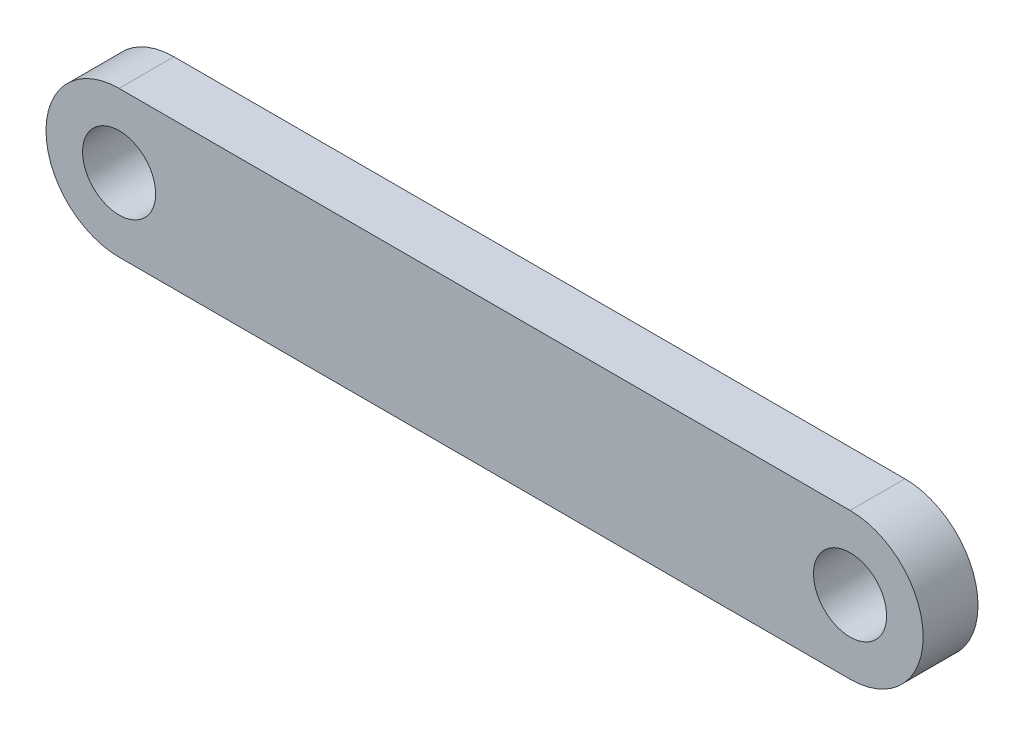
ISO-10303-21;
HEADER;
FILE_DESCRIPTION(('STEP AP214'),'2;1');
FILE_NAME('part.step','',(''),(''),'','','');
FILE_SCHEMA(('AUTOMOTIVE_DESIGN { 1 0 10303 214 1 1 1 1 }'));
ENDSEC;
DATA;
#1=APPLICATION_CONTEXT('core data for automotive mechanical design processes');
#2=APPLICATION_PROTOCOL_DEFINITION('international standard','automotive_design',2000,#1);
#3=PRODUCT_CONTEXT('',#1,'mechanical');
#4=PRODUCT('Part','Part','',(#3));
#5=PRODUCT_RELATED_PRODUCT_CATEGORY('part','',(#4));
#6=PRODUCT_DEFINITION_FORMATION('','',#4);
#7=PRODUCT_DEFINITION_CONTEXT('part definition',#1,'design');
#8=PRODUCT_DEFINITION('design','',#6,#7);
#9=PRODUCT_DEFINITION_SHAPE('','',#8);
#10=(LENGTH_UNIT() NAMED_UNIT(*) SI_UNIT(.MILLI.,.METRE.));
#11=(NAMED_UNIT(*) PLANE_ANGLE_UNIT() SI_UNIT($,.RADIAN.));
#12=(NAMED_UNIT(*) SI_UNIT($,.STERADIAN.) SOLID_ANGLE_UNIT());
#13=UNCERTAINTY_MEASURE_WITH_UNIT(LENGTH_MEASURE(1.E-05),#10,'distance_accuracy_value','');
#14=(GEOMETRIC_REPRESENTATION_CONTEXT(3) GLOBAL_UNCERTAINTY_ASSIGNED_CONTEXT((#13)) GLOBAL_UNIT_ASSIGNED_CONTEXT((#10,
#11,#12)) REPRESENTATION_CONTEXT('',''));
#15=CARTESIAN_POINT('',(0.,0.,0.));
#16=DIRECTION('',(0.,0.,1.));
#17=DIRECTION('',(1.,0.,0.));
#18=AXIS2_PLACEMENT_3D('',#15,#16,#17);
#19=CARTESIAN_POINT('',(-25.4,0.,3.81));
#20=DIRECTION('',(0.,0.,1.));
#21=DIRECTION('',(1.,0.,0.));
#22=AXIS2_PLACEMENT_3D('',#19,#20,#21);
#23=PLANE('',#22);
#24=CARTESIAN_POINT('',(-25.4,0.,3.81));
#25=DIRECTION('',(0.,0.,1.));
#26=DIRECTION('',(1.,0.,0.));
#27=AXIS2_PLACEMENT_3D('',#24,#25,#26);
#28=CIRCLE('',#27,2.54);
#29=CARTESIAN_POINT('',(-27.94,0.,3.81));
#30=VERTEX_POINT('',#29);
#31=EDGE_CURVE('E104',#30,#30,#28,.T.);
#32=ORIENTED_EDGE('',*,*,#31,.F.);
#33=EDGE_LOOP('',(#32));
#34=FACE_BOUND('',#33,.T.);
#35=CARTESIAN_POINT('',(-25.4,0.,3.81));
#36=DIRECTION('',(0.,0.,1.));
#37=DIRECTION('',(1.,0.,0.));
#38=AXIS2_PLACEMENT_3D('',#35,#36,#37);
#39=CIRCLE('',#38,5.08);
#40=CARTESIAN_POINT('',(-25.4,5.08,3.81));
#41=VERTEX_POINT('',#40);
#42=CARTESIAN_POINT('',(-25.4,-5.08,3.81));
#43=VERTEX_POINT('',#42);
#44=EDGE_CURVE('E89',#41,#43,#39,.T.);
#45=ORIENTED_EDGE('',*,*,#44,.T.);
#46=DIRECTION('',(1.,0.,0.));
#47=VECTOR('',#46,1.);
#48=CARTESIAN_POINT('',(-25.4,-5.08,3.81));
#49=LINE('',#48,#47);
#50=CARTESIAN_POINT('',(25.4,-5.07999999999999,3.81));
#51=VERTEX_POINT('',#50);
#52=EDGE_CURVE('E84',#43,#51,#49,.T.);
#53=ORIENTED_EDGE('',*,*,#52,.T.);
#54=CARTESIAN_POINT('',(25.4,0.,3.81));
#55=DIRECTION('',(0.,0.,1.));
#56=DIRECTION('',(1.,0.,0.));
#57=AXIS2_PLACEMENT_3D('',#54,#55,#56);
#58=CIRCLE('',#57,5.08);
#59=CARTESIAN_POINT('',(25.4,5.08000000000001,3.81));
#60=VERTEX_POINT('',#59);
#61=EDGE_CURVE('E87',#51,#60,#58,.T.);
#62=ORIENTED_EDGE('',*,*,#61,.T.);
#63=DIRECTION('',(-1.,0.,0.));
#64=VECTOR('',#63,1.);
#65=CARTESIAN_POINT('',(-25.4,5.08,3.81));
#66=LINE('',#65,#64);
#67=EDGE_CURVE('E54',#60,#41,#66,.T.);
#68=ORIENTED_EDGE('',*,*,#67,.T.);
#69=EDGE_LOOP('',(#45,#53,#62,#68));
#70=FACE_BOUND('',#69,.T.);
#71=CARTESIAN_POINT('',(25.4,0.,3.81));
#72=DIRECTION('',(0.,0.,1.));
#73=DIRECTION('',(1.,0.,0.));
#74=AXIS2_PLACEMENT_3D('',#71,#72,#73);
#75=CIRCLE('',#74,2.54);
#76=CARTESIAN_POINT('',(22.86,0.,3.81));
#77=VERTEX_POINT('',#76);
#78=EDGE_CURVE('E119',#77,#77,#75,.T.);
#79=ORIENTED_EDGE('',*,*,#78,.F.);
#80=EDGE_LOOP('',(#79));
#81=FACE_BOUND('',#80,.T.);
#82=ADVANCED_FACE('F37',(#34,#70,#81),#23,.T.);
#83=CARTESIAN_POINT('',(-25.4,0.,0.));
#84=DIRECTION('',(0.,0.,1.));
#85=DIRECTION('',(1.,0.,0.));
#86=AXIS2_PLACEMENT_3D('',#83,#84,#85);
#87=PLANE('',#86);
#88=CARTESIAN_POINT('',(-25.4,0.,0.));
#89=DIRECTION('',(0.,0.,1.));
#90=DIRECTION('',(1.,0.,0.));
#91=AXIS2_PLACEMENT_3D('',#88,#89,#90);
#92=CIRCLE('',#91,5.08);
#93=CARTESIAN_POINT('',(-25.4,5.08,0.));
#94=VERTEX_POINT('',#93);
#95=CARTESIAN_POINT('',(-25.4,-5.08,0.));
#96=VERTEX_POINT('',#95);
#97=EDGE_CURVE('E101',#94,#96,#92,.T.);
#98=ORIENTED_EDGE('',*,*,#97,.F.);
#99=DIRECTION('',(-1.,0.,0.));
#100=VECTOR('',#99,1.);
#101=CARTESIAN_POINT('',(-25.4,5.08,0.));
#102=LINE('',#101,#100);
#103=CARTESIAN_POINT('',(25.4,5.08000000000001,0.));
#104=VERTEX_POINT('',#103);
#105=EDGE_CURVE('E77',#104,#94,#102,.T.);
#106=ORIENTED_EDGE('',*,*,#105,.F.);
#107=CARTESIAN_POINT('',(25.4,0.,0.));
#108=DIRECTION('',(0.,0.,1.));
#109=DIRECTION('',(1.,0.,0.));
#110=AXIS2_PLACEMENT_3D('',#107,#108,#109);
#111=CIRCLE('',#110,5.08);
#112=CARTESIAN_POINT('',(25.4,-5.07999999999999,0.));
#113=VERTEX_POINT('',#112);
#114=EDGE_CURVE('E71',#113,#104,#111,.T.);
#115=ORIENTED_EDGE('',*,*,#114,.F.);
#116=DIRECTION('',(1.,0.,0.));
#117=VECTOR('',#116,1.);
#118=CARTESIAN_POINT('',(-25.4,-5.08,0.));
#119=LINE('',#118,#117);
#120=EDGE_CURVE('E93',#96,#113,#119,.T.);
#121=ORIENTED_EDGE('',*,*,#120,.F.);
#122=EDGE_LOOP('',(#98,#106,#115,#121));
#123=FACE_BOUND('',#122,.T.);
#124=CARTESIAN_POINT('',(-25.4,0.,0.));
#125=DIRECTION('',(0.,0.,1.));
#126=DIRECTION('',(1.,0.,0.));
#127=AXIS2_PLACEMENT_3D('',#124,#125,#126);
#128=CIRCLE('',#127,2.54);
#129=CARTESIAN_POINT('',(-27.94,0.,0.));
#130=VERTEX_POINT('',#129);
#131=EDGE_CURVE('E116',#130,#130,#128,.T.);
#132=ORIENTED_EDGE('',*,*,#131,.T.);
#133=EDGE_LOOP('',(#132));
#134=FACE_BOUND('',#133,.T.);
#135=CARTESIAN_POINT('',(25.4,0.,0.));
#136=DIRECTION('',(0.,0.,1.));
#137=DIRECTION('',(1.,0.,0.));
#138=AXIS2_PLACEMENT_3D('',#135,#136,#137);
#139=CIRCLE('',#138,2.54);
#140=CARTESIAN_POINT('',(22.86,0.,0.));
#141=VERTEX_POINT('',#140);
#142=EDGE_CURVE('E122',#141,#141,#139,.T.);
#143=ORIENTED_EDGE('',*,*,#142,.T.);
#144=EDGE_LOOP('',(#143));
#145=FACE_BOUND('',#144,.T.);
#146=ADVANCED_FACE('F112',(#123,#134,#145),#87,.F.);
#147=CARTESIAN_POINT('',(-25.4,0.,3.81));
#148=DIRECTION('',(0.,0.,-1.));
#149=DIRECTION('',(-1.,0.,0.));
#150=AXIS2_PLACEMENT_3D('',#147,#148,#149);
#151=CYLINDRICAL_SURFACE('',#150,5.08);
#152=ORIENTED_EDGE('',*,*,#97,.T.);
#153=DIRECTION('',(0.,0.,-1.));
#154=VECTOR('',#153,1.);
#155=CARTESIAN_POINT('',(-25.4,-5.08,3.81));
#156=LINE('',#155,#154);
#157=EDGE_CURVE('E11',#43,#96,#156,.T.);
#158=ORIENTED_EDGE('',*,*,#157,.F.);
#159=ORIENTED_EDGE('',*,*,#44,.F.);
#160=DIRECTION('',(0.,0.,-1.));
#161=VECTOR('',#160,1.);
#162=CARTESIAN_POINT('',(-25.4,5.08,3.81));
#163=LINE('',#162,#161);
#164=EDGE_CURVE('E97',#41,#94,#163,.T.);
#165=ORIENTED_EDGE('',*,*,#164,.T.);
#166=EDGE_LOOP('',(#152,#158,#159,#165));
#167=FACE_BOUND('',#166,.T.);
#168=ADVANCED_FACE('F39',(#167),#151,.T.);
#169=CARTESIAN_POINT('',(-25.4,-5.08,3.81));
#170=DIRECTION('',(0.,1.,0.));
#171=DIRECTION('',(-1.,0.,0.));
#172=AXIS2_PLACEMENT_3D('',#169,#170,#171);
#173=PLANE('',#172);
#174=ORIENTED_EDGE('',*,*,#120,.T.);
#175=DIRECTION('',(0.,0.,-1.));
#176=VECTOR('',#175,1.);
#177=CARTESIAN_POINT('',(25.4,-5.07999999999999,3.81));
#178=LINE('',#177,#176);
#179=EDGE_CURVE('E46',#51,#113,#178,.T.);
#180=ORIENTED_EDGE('',*,*,#179,.F.);
#181=ORIENTED_EDGE('',*,*,#52,.F.);
#182=ORIENTED_EDGE('',*,*,#157,.T.);
#183=EDGE_LOOP('',(#174,#180,#181,#182));
#184=FACE_BOUND('',#183,.T.);
#185=ADVANCED_FACE('F92',(#184),#173,.F.);
#186=CARTESIAN_POINT('',(25.4,0.,3.81));
#187=DIRECTION('',(0.,0.,-1.));
#188=DIRECTION('',(-1.,0.,0.));
#189=AXIS2_PLACEMENT_3D('',#186,#187,#188);
#190=CYLINDRICAL_SURFACE('',#189,5.08);
#191=ORIENTED_EDGE('',*,*,#114,.T.);
#192=DIRECTION('',(0.,0.,-1.));
#193=VECTOR('',#192,1.);
#194=CARTESIAN_POINT('',(25.4,5.08000000000001,3.81));
#195=LINE('',#194,#193);
#196=EDGE_CURVE('E94',#60,#104,#195,.T.);
#197=ORIENTED_EDGE('',*,*,#196,.F.);
#198=ORIENTED_EDGE('',*,*,#61,.F.);
#199=ORIENTED_EDGE('',*,*,#179,.T.);
#200=EDGE_LOOP('',(#191,#197,#198,#199));
#201=FACE_BOUND('',#200,.T.);
#202=ADVANCED_FACE('F95',(#201),#190,.T.);
#203=CARTESIAN_POINT('',(-25.4,5.08,3.81));
#204=DIRECTION('',(0.,-1.,0.));
#205=DIRECTION('',(1.,0.,0.));
#206=AXIS2_PLACEMENT_3D('',#203,#204,#205);
#207=PLANE('',#206);
#208=ORIENTED_EDGE('',*,*,#105,.T.);
#209=ORIENTED_EDGE('',*,*,#164,.F.);
#210=ORIENTED_EDGE('',*,*,#67,.F.);
#211=ORIENTED_EDGE('',*,*,#196,.T.);
#212=EDGE_LOOP('',(#208,#209,#210,#211));
#213=FACE_BOUND('',#212,.T.);
#214=ADVANCED_FACE('F109',(#213),#207,.F.);
#215=CARTESIAN_POINT('',(-25.4,0.,3.81));
#216=DIRECTION('',(0.,0.,-1.));
#217=DIRECTION('',(-1.,0.,0.));
#218=AXIS2_PLACEMENT_3D('',#215,#216,#217);
#219=CYLINDRICAL_SURFACE('',#218,2.54);
#220=CARTESIAN_POINT('',(-27.94,0.,3.81));
#221=CARTESIAN_POINT('',(-27.94,0.,3.7703125));
#222=CARTESIAN_POINT('',(-27.94,0.,3.730625));
#223=CARTESIAN_POINT('',(-27.94,0.,3.65125));
#224=CARTESIAN_POINT('',(-27.94,0.,3.6115625));
#225=CARTESIAN_POINT('',(-27.94,0.,3.5321875));
#226=CARTESIAN_POINT('',(-27.94,0.,3.4925));
#227=CARTESIAN_POINT('',(-27.94,0.,3.413125));
#228=CARTESIAN_POINT('',(-27.94,0.,3.3734375));
#229=CARTESIAN_POINT('',(-27.94,0.,3.2940625));
#230=CARTESIAN_POINT('',(-27.94,0.,3.254375));
#231=CARTESIAN_POINT('',(-27.94,0.,3.175));
#232=CARTESIAN_POINT('',(-27.94,0.,3.1353125));
#233=CARTESIAN_POINT('',(-27.94,0.,3.0559375));
#234=CARTESIAN_POINT('',(-27.94,0.,3.01625));
#235=CARTESIAN_POINT('',(-27.94,0.,2.936875));
#236=CARTESIAN_POINT('',(-27.94,0.,2.8971875));
#237=CARTESIAN_POINT('',(-27.94,0.,2.8178125));
#238=CARTESIAN_POINT('',(-27.94,0.,2.778125));
#239=CARTESIAN_POINT('',(-27.94,0.,2.69875));
#240=CARTESIAN_POINT('',(-27.94,0.,2.6590625));
#241=CARTESIAN_POINT('',(-27.94,0.,2.5796875));
#242=CARTESIAN_POINT('',(-27.94,0.,2.54));
#243=CARTESIAN_POINT('',(-27.94,0.,2.460625));
#244=CARTESIAN_POINT('',(-27.94,0.,2.4209375));
#245=CARTESIAN_POINT('',(-27.94,0.,2.3415625));
#246=CARTESIAN_POINT('',(-27.94,0.,2.301875));
#247=CARTESIAN_POINT('',(-27.94,0.,2.2225));
#248=CARTESIAN_POINT('',(-27.94,0.,2.1828125));
#249=CARTESIAN_POINT('',(-27.94,0.,2.1034375));
#250=CARTESIAN_POINT('',(-27.94,0.,2.06375));
#251=CARTESIAN_POINT('',(-27.94,0.,1.984375));
#252=CARTESIAN_POINT('',(-27.94,0.,1.9446875));
#253=CARTESIAN_POINT('',(-27.94,0.,1.8653125));
#254=CARTESIAN_POINT('',(-27.94,0.,1.825625));
#255=CARTESIAN_POINT('',(-27.94,0.,1.74625));
#256=CARTESIAN_POINT('',(-27.94,0.,1.7065625));
#257=CARTESIAN_POINT('',(-27.94,0.,1.6271875));
#258=CARTESIAN_POINT('',(-27.94,0.,1.5875));
#259=CARTESIAN_POINT('',(-27.94,0.,1.508125));
#260=CARTESIAN_POINT('',(-27.94,0.,1.4684375));
#261=CARTESIAN_POINT('',(-27.94,0.,1.3890625));
#262=CARTESIAN_POINT('',(-27.94,0.,1.349375));
#263=CARTESIAN_POINT('',(-27.94,0.,1.27));
#264=CARTESIAN_POINT('',(-27.94,0.,1.2303125));
#265=CARTESIAN_POINT('',(-27.94,0.,1.1509375));
#266=CARTESIAN_POINT('',(-27.94,0.,1.11125));
#267=CARTESIAN_POINT('',(-27.94,0.,1.031875));
#268=CARTESIAN_POINT('',(-27.94,0.,0.9921875));
#269=CARTESIAN_POINT('',(-27.94,0.,0.9128125));
#270=CARTESIAN_POINT('',(-27.94,0.,0.873125));
#271=CARTESIAN_POINT('',(-27.94,0.,0.79375));
#272=CARTESIAN_POINT('',(-27.94,0.,0.7540625));
#273=CARTESIAN_POINT('',(-27.94,0.,0.6746875));
#274=CARTESIAN_POINT('',(-27.94,0.,0.635));
#275=CARTESIAN_POINT('',(-27.94,0.,0.555625));
#276=CARTESIAN_POINT('',(-27.94,0.,0.5159375));
#277=CARTESIAN_POINT('',(-27.94,0.,0.4365625));
#278=CARTESIAN_POINT('',(-27.94,0.,0.396875));
#279=CARTESIAN_POINT('',(-27.94,0.,0.3175));
#280=CARTESIAN_POINT('',(-27.94,0.,0.2778125));
#281=CARTESIAN_POINT('',(-27.94,0.,0.1984375));
#282=CARTESIAN_POINT('',(-27.94,0.,0.15875));
#283=CARTESIAN_POINT('',(-27.94,0.,0.0793749999999999));
#284=CARTESIAN_POINT('',(-27.94,0.,0.0396874999999999));
#285=CARTESIAN_POINT('',(-27.94,0.,0.));
#286=B_SPLINE_CURVE_WITH_KNOTS('',3,(#220,#221,#222,#223,#224,#225,#226,#227,#228,#229,#230,
#231,#232,#233,#234,#235,#236,#237,#238,#239,#240,#241,#242,#243,#244,#245,#246,#247,#248,#249,
#250,#251,#252,#253,#254,#255,#256,#257,#258,#259,#260,#261,#262,#263,#264,#265,#266,#267,#268,
#269,#270,#271,#272,#273,#274,#275,#276,#277,#278,#279,#280,#281,#282,#283,#284,#285),
.UNSPECIFIED.,.F.,.F.,(4,2,2,2,2,2,2,2,2,2,2,2,2,2,2,2,2,2,2,2,2,2,2,2,2,2,2,2,2,2,2,2,4),(0.,
0.1190625,0.238125,0.3571875,0.47625,0.5953125,0.714375,0.8334375,0.9525,1.0715625,1.190625,
1.3096875,1.42875,1.5478125,1.666875,1.7859375,1.905,2.0240625,2.143125,2.2621875,2.38125,
2.5003125,2.619375,2.7384375,2.8575,2.9765625,3.095625,3.2146875,3.33375,3.4528125,3.571875,
3.6909375,3.81),.UNSPECIFIED.);
#287=EDGE_CURVE('BSEAM139',#30,#130,#286,.T.);
#288=ORIENTED_EDGE('',*,*,#31,.T.);
#289=ORIENTED_EDGE('',*,*,#131,.F.);
#290=ORIENTED_EDGE('',*,*,#287,.T.);
#291=ORIENTED_EDGE('',*,*,#287,.F.);
#292=EDGE_LOOP('',(#288,#290,#289,#291));
#293=FACE_BOUND('',#292,.T.);
#294=ADVANCED_FACE('F139',(#293),#219,.F.);
#295=CARTESIAN_POINT('',(25.4,0.,3.81));
#296=DIRECTION('',(0.,0.,-1.));
#297=DIRECTION('',(-1.,0.,0.));
#298=AXIS2_PLACEMENT_3D('',#295,#296,#297);
#299=CYLINDRICAL_SURFACE('',#298,2.54);
#300=CARTESIAN_POINT('',(22.86,0.,3.81));
#301=CARTESIAN_POINT('',(22.86,0.,3.7703125));
#302=CARTESIAN_POINT('',(22.86,0.,3.730625));
#303=CARTESIAN_POINT('',(22.86,0.,3.65125));
#304=CARTESIAN_POINT('',(22.86,0.,3.6115625));
#305=CARTESIAN_POINT('',(22.86,0.,3.5321875));
#306=CARTESIAN_POINT('',(22.86,0.,3.4925));
#307=CARTESIAN_POINT('',(22.86,0.,3.413125));
#308=CARTESIAN_POINT('',(22.86,0.,3.3734375));
#309=CARTESIAN_POINT('',(22.86,0.,3.2940625));
#310=CARTESIAN_POINT('',(22.86,0.,3.254375));
#311=CARTESIAN_POINT('',(22.86,0.,3.175));
#312=CARTESIAN_POINT('',(22.86,0.,3.1353125));
#313=CARTESIAN_POINT('',(22.86,0.,3.0559375));
#314=CARTESIAN_POINT('',(22.86,0.,3.01625));
#315=CARTESIAN_POINT('',(22.86,0.,2.936875));
#316=CARTESIAN_POINT('',(22.86,0.,2.8971875));
#317=CARTESIAN_POINT('',(22.86,0.,2.8178125));
#318=CARTESIAN_POINT('',(22.86,0.,2.778125));
#319=CARTESIAN_POINT('',(22.86,0.,2.69875));
#320=CARTESIAN_POINT('',(22.86,0.,2.6590625));
#321=CARTESIAN_POINT('',(22.86,0.,2.5796875));
#322=CARTESIAN_POINT('',(22.86,0.,2.54));
#323=CARTESIAN_POINT('',(22.86,0.,2.460625));
#324=CARTESIAN_POINT('',(22.86,0.,2.4209375));
#325=CARTESIAN_POINT('',(22.86,0.,2.3415625));
#326=CARTESIAN_POINT('',(22.86,0.,2.301875));
#327=CARTESIAN_POINT('',(22.86,0.,2.2225));
#328=CARTESIAN_POINT('',(22.86,0.,2.1828125));
#329=CARTESIAN_POINT('',(22.86,0.,2.1034375));
#330=CARTESIAN_POINT('',(22.86,0.,2.06375));
#331=CARTESIAN_POINT('',(22.86,0.,1.984375));
#332=CARTESIAN_POINT('',(22.86,0.,1.9446875));
#333=CARTESIAN_POINT('',(22.86,0.,1.8653125));
#334=CARTESIAN_POINT('',(22.86,0.,1.825625));
#335=CARTESIAN_POINT('',(22.86,0.,1.74625));
#336=CARTESIAN_POINT('',(22.86,0.,1.7065625));
#337=CARTESIAN_POINT('',(22.86,0.,1.6271875));
#338=CARTESIAN_POINT('',(22.86,0.,1.5875));
#339=CARTESIAN_POINT('',(22.86,0.,1.508125));
#340=CARTESIAN_POINT('',(22.86,0.,1.4684375));
#341=CARTESIAN_POINT('',(22.86,0.,1.3890625));
#342=CARTESIAN_POINT('',(22.86,0.,1.349375));
#343=CARTESIAN_POINT('',(22.86,0.,1.27));
#344=CARTESIAN_POINT('',(22.86,0.,1.2303125));
#345=CARTESIAN_POINT('',(22.86,0.,1.1509375));
#346=CARTESIAN_POINT('',(22.86,0.,1.11125));
#347=CARTESIAN_POINT('',(22.86,0.,1.031875));
#348=CARTESIAN_POINT('',(22.86,0.,0.9921875));
#349=CARTESIAN_POINT('',(22.86,0.,0.9128125));
#350=CARTESIAN_POINT('',(22.86,0.,0.873125));
#351=CARTESIAN_POINT('',(22.86,0.,0.79375));
#352=CARTESIAN_POINT('',(22.86,0.,0.7540625));
#353=CARTESIAN_POINT('',(22.86,0.,0.6746875));
#354=CARTESIAN_POINT('',(22.86,0.,0.635));
#355=CARTESIAN_POINT('',(22.86,0.,0.555625));
#356=CARTESIAN_POINT('',(22.86,0.,0.5159375));
#357=CARTESIAN_POINT('',(22.86,0.,0.4365625));
#358=CARTESIAN_POINT('',(22.86,0.,0.396875));
#359=CARTESIAN_POINT('',(22.86,0.,0.3175));
#360=CARTESIAN_POINT('',(22.86,0.,0.2778125));
#361=CARTESIAN_POINT('',(22.86,0.,0.1984375));
#362=CARTESIAN_POINT('',(22.86,0.,0.15875));
#363=CARTESIAN_POINT('',(22.86,0.,0.0793749999999999));
#364=CARTESIAN_POINT('',(22.86,0.,0.0396874999999999));
#365=CARTESIAN_POINT('',(22.86,0.,0.));
#366=B_SPLINE_CURVE_WITH_KNOTS('',3,(#300,#301,#302,#303,#304,#305,#306,#307,#308,#309,#310,
#311,#312,#313,#314,#315,#316,#317,#318,#319,#320,#321,#322,#323,#324,#325,#326,#327,#328,#329,
#330,#331,#332,#333,#334,#335,#336,#337,#338,#339,#340,#341,#342,#343,#344,#345,#346,#347,#348,
#349,#350,#351,#352,#353,#354,#355,#356,#357,#358,#359,#360,#361,#362,#363,#364,#365),
.UNSPECIFIED.,.F.,.F.,(4,2,2,2,2,2,2,2,2,2,2,2,2,2,2,2,2,2,2,2,2,2,2,2,2,2,2,2,2,2,2,2,4),(0.,
0.1190625,0.238125,0.3571875,0.47625,0.5953125,0.714375,0.8334375,0.9525,1.0715625,1.190625,
1.3096875,1.42875,1.5478125,1.666875,1.7859375,1.905,2.0240625,2.143125,2.2621875,2.38125,
2.5003125,2.619375,2.7384375,2.8575,2.9765625,3.095625,3.2146875,3.33375,3.4528125,3.571875,
3.6909375,3.81),.UNSPECIFIED.);
#367=EDGE_CURVE('BSEAM128',#77,#141,#366,.T.);
#368=ORIENTED_EDGE('',*,*,#78,.T.);
#369=ORIENTED_EDGE('',*,*,#142,.F.);
#370=ORIENTED_EDGE('',*,*,#367,.T.);
#371=ORIENTED_EDGE('',*,*,#367,.F.);
#372=EDGE_LOOP('',(#368,#370,#369,#371));
#373=FACE_BOUND('',#372,.T.);
#374=ADVANCED_FACE('F128',(#373),#299,.F.);
#375=CLOSED_SHELL('',(#82,#146,#168,#185,#202,#214,#294,#374));
#376=MANIFOLD_SOLID_BREP('B2',#375);
#377=ADVANCED_BREP_SHAPE_REPRESENTATION('',(#18,#376),#14);
#378=SHAPE_DEFINITION_REPRESENTATION(#9,#377);
ENDSEC;
END-ISO-10303-21;
